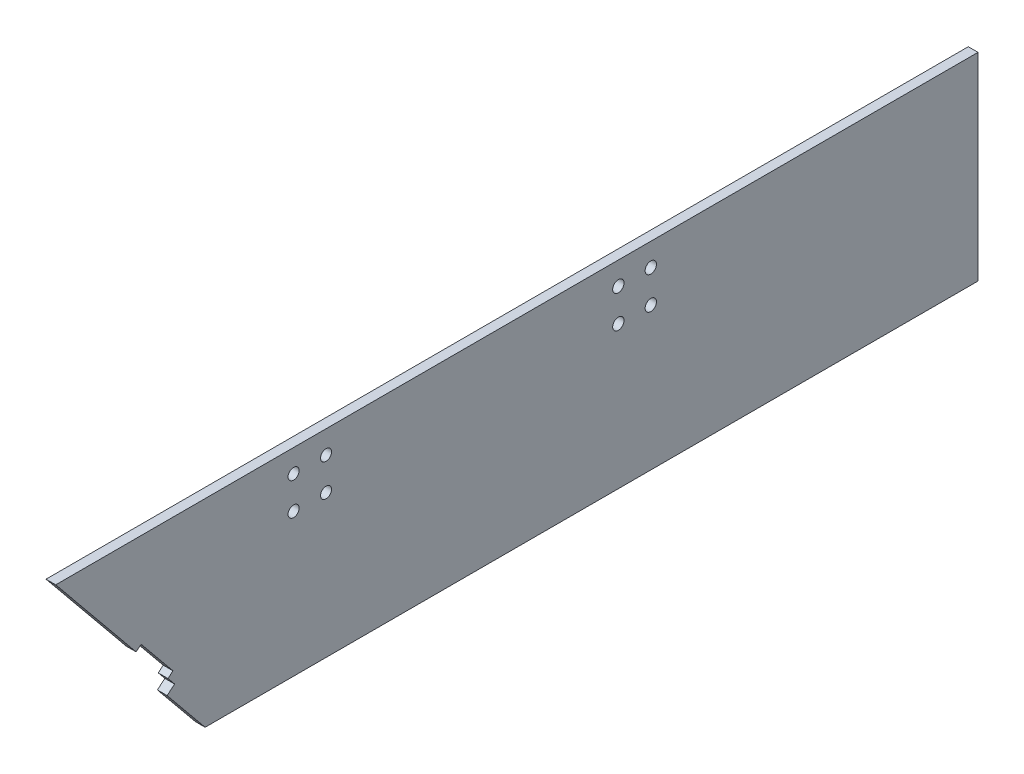
ISO-10303-21;
HEADER;
FILE_DESCRIPTION(('STEP AP214'),'2;1');
FILE_NAME('part.step','',(''),(''),'','','');
FILE_SCHEMA(('AUTOMOTIVE_DESIGN { 1 0 10303 214 1 1 1 1 }'));
ENDSEC;
DATA;
#1=APPLICATION_CONTEXT('core data for automotive mechanical design processes');
#2=APPLICATION_PROTOCOL_DEFINITION('international standard','automotive_design',2000,#1);
#3=PRODUCT_CONTEXT('',#1,'mechanical');
#4=PRODUCT('Part','Part','',(#3));
#5=PRODUCT_RELATED_PRODUCT_CATEGORY('part','',(#4));
#6=PRODUCT_DEFINITION_FORMATION('','',#4);
#7=PRODUCT_DEFINITION_CONTEXT('part definition',#1,'design');
#8=PRODUCT_DEFINITION('design','',#6,#7);
#9=PRODUCT_DEFINITION_SHAPE('','',#8);
#10=(LENGTH_UNIT() NAMED_UNIT(*) SI_UNIT(.MILLI.,.METRE.));
#11=(NAMED_UNIT(*) PLANE_ANGLE_UNIT() SI_UNIT($,.RADIAN.));
#12=(NAMED_UNIT(*) SI_UNIT($,.STERADIAN.) SOLID_ANGLE_UNIT());
#13=UNCERTAINTY_MEASURE_WITH_UNIT(LENGTH_MEASURE(1.E-05),#10,'distance_accuracy_value','');
#14=(GEOMETRIC_REPRESENTATION_CONTEXT(3) GLOBAL_UNCERTAINTY_ASSIGNED_CONTEXT((#13)) GLOBAL_UNIT_ASSIGNED_CONTEXT((#10,
#11,#12)) REPRESENTATION_CONTEXT('',''));
#15=CARTESIAN_POINT('',(0.,0.,0.));
#16=DIRECTION('',(0.,0.,1.));
#17=DIRECTION('',(1.,0.,0.));
#18=AXIS2_PLACEMENT_3D('',#15,#16,#17);
#19=CARTESIAN_POINT('',(3.,0.,220.));
#20=DIRECTION('',(1.,0.,0.));
#21=DIRECTION('',(0.,1.,0.));
#22=AXIS2_PLACEMENT_3D('',#19,#20,#21);
#23=PLANE('',#22);
#24=CARTESIAN_POINT('',(3.,58.999999999968,110.75468208532));
#25=DIRECTION('',(-1.,0.,0.));
#26=DIRECTION('',(0.,0.,1.));
#27=AXIS2_PLACEMENT_3D('',#24,#25,#26);
#28=CIRCLE('',#27,1.75);
#29=CARTESIAN_POINT('',(3.,58.999999999968,112.50468208532));
#30=VERTEX_POINT('',#29);
#31=EDGE_CURVE('E224',#30,#30,#28,.T.);
#32=ORIENTED_EDGE('',*,*,#31,.T.);
#33=EDGE_LOOP('',(#32));
#34=FACE_BOUND('',#33,.T.);
#35=CARTESIAN_POINT('',(3.,58.999999999968,100.75468208532));
#36=DIRECTION('',(-1.,0.,0.));
#37=DIRECTION('',(0.,0.,1.));
#38=AXIS2_PLACEMENT_3D('',#35,#36,#37);
#39=CIRCLE('',#38,1.75);
#40=CARTESIAN_POINT('',(3.,58.999999999968,102.50468208532));
#41=VERTEX_POINT('',#40);
#42=EDGE_CURVE('E238',#41,#41,#39,.T.);
#43=ORIENTED_EDGE('',*,*,#42,.T.);
#44=EDGE_LOOP('',(#43));
#45=FACE_BOUND('',#44,.T.);
#46=CARTESIAN_POINT('',(3.,68.999999999968,100.75468208532));
#47=DIRECTION('',(-1.,0.,0.));
#48=DIRECTION('',(0.,0.,1.));
#49=AXIS2_PLACEMENT_3D('',#46,#47,#48);
#50=CIRCLE('',#49,1.75);
#51=CARTESIAN_POINT('',(3.,68.999999999968,102.50468208532));
#52=VERTEX_POINT('',#51);
#53=EDGE_CURVE('E230',#52,#52,#50,.T.);
#54=ORIENTED_EDGE('',*,*,#53,.T.);
#55=EDGE_LOOP('',(#54));
#56=FACE_BOUND('',#55,.T.);
#57=CARTESIAN_POINT('',(3.,68.999999999968,110.75468208532));
#58=DIRECTION('',(-1.,0.,0.));
#59=DIRECTION('',(0.,0.,1.));
#60=AXIS2_PLACEMENT_3D('',#57,#58,#59);
#61=CIRCLE('',#60,1.75);
#62=CARTESIAN_POINT('',(3.,68.999999999968,112.50468208532));
#63=VERTEX_POINT('',#62);
#64=EDGE_CURVE('E249',#63,#63,#61,.T.);
#65=ORIENTED_EDGE('',*,*,#64,.T.);
#66=EDGE_LOOP('',(#65));
#67=FACE_BOUND('',#66,.T.);
#68=DIRECTION('',(0.,0.,-1.));
#69=VECTOR('',#68,1.);
#70=CARTESIAN_POINT('',(3.,15.,0.));
#71=LINE('',#70,#69);
#72=CARTESIAN_POINT('',(3.,15.,238.));
#73=VERTEX_POINT('',#72);
#74=CARTESIAN_POINT('',(3.,15.,0.));
#75=VERTEX_POINT('',#74);
#76=EDGE_CURVE('E122',#73,#75,#71,.T.);
#77=ORIENTED_EDGE('',*,*,#76,.T.);
#78=DIRECTION('',(0.,-1.,0.));
#79=VECTOR('',#78,1.);
#80=CARTESIAN_POINT('',(3.,0.,0.));
#81=LINE('',#80,#79);
#82=CARTESIAN_POINT('',(3.,76.,0.));
#83=VERTEX_POINT('',#82);
#84=EDGE_CURVE('E316',#83,#75,#81,.T.);
#85=ORIENTED_EDGE('',*,*,#84,.F.);
#86=DIRECTION('',(0.,0.,-1.));
#87=VECTOR('',#86,1.);
#88=CARTESIAN_POINT('',(3.,76.,220.));
#89=LINE('',#88,#87);
#90=CARTESIAN_POINT('',(3.,76.,284.));
#91=VERTEX_POINT('',#90);
#92=EDGE_CURVE('E11',#91,#83,#89,.T.);
#93=ORIENTED_EDGE('',*,*,#92,.F.);
#94=DIRECTION('',(0.,0.774168521996595,0.63297954117776));
#95=VECTOR('',#94,1.);
#96=CARTESIAN_POINT('',(3.,45.7367160679064,259.255982342882));
#97=LINE('',#96,#95);
#98=CARTESIAN_POINT('',(3.,45.7367160679064,259.255982342882));
#99=VERTEX_POINT('',#98);
#100=EDGE_CURVE('E142',#99,#91,#97,.T.);
#101=ORIENTED_EDGE('',*,*,#100,.F.);
#102=DIRECTION('',(0.,-0.632979541177748,0.774168521996605));
#103=VECTOR('',#102,1.);
#104=CARTESIAN_POINT('',(3.,47.0026751502619,257.707645298889));
#105=LINE('',#104,#103);
#106=CARTESIAN_POINT('',(3.,47.0026751502619,257.707645298889));
#107=VERTEX_POINT('',#106);
#108=EDGE_CURVE('E171',#107,#99,#105,.T.);
#109=ORIENTED_EDGE('',*,*,#108,.F.);
#110=DIRECTION('',(0.,0.774168521996594,0.632979541177761));
#111=VECTOR('',#110,1.);
#112=CARTESIAN_POINT('',(3.,35.0030630593147,247.896462410633));
#113=LINE('',#112,#111);
#114=CARTESIAN_POINT('',(3.,35.0030630593147,247.896462410633));
#115=VERTEX_POINT('',#114);
#116=EDGE_CURVE('E167',#115,#107,#113,.T.);
#117=ORIENTED_EDGE('',*,*,#116,.F.);
#118=DIRECTION('',(0.,0.632979541177761,-0.774168521996594));
#119=VECTOR('',#118,1.);
#120=CARTESIAN_POINT('',(3.,33.7371039769592,249.444799454626));
#121=LINE('',#120,#119);
#122=CARTESIAN_POINT('',(3.,33.7371039769592,249.444799454626));
#123=VERTEX_POINT('',#122);
#124=EDGE_CURVE('E163',#123,#115,#121,.T.);
#125=ORIENTED_EDGE('',*,*,#124,.F.);
#126=DIRECTION('',(0.,0.774168521996594,0.632979541177761));
#127=VECTOR('',#126,1.);
#128=CARTESIAN_POINT('',(3.,31.2210562804703,247.387615945799));
#129=LINE('',#128,#127);
#130=CARTESIAN_POINT('',(3.,31.2210562804703,247.387615945799));
#131=VERTEX_POINT('',#130);
#132=EDGE_CURVE('E154',#131,#123,#129,.T.);
#133=ORIENTED_EDGE('',*,*,#132,.F.);
#134=DIRECTION('',(0.,0.632979541177761,-0.774168521996594));
#135=VECTOR('',#134,1.);
#136=CARTESIAN_POINT('',(3.,29.322117656937,249.710121511789));
#137=LINE('',#136,#135);
#138=CARTESIAN_POINT('',(3.,29.322117656937,249.710121511789));
#139=VERTEX_POINT('',#138);
#140=EDGE_CURVE('E148',#139,#131,#137,.T.);
#141=ORIENTED_EDGE('',*,*,#140,.F.);
#142=DIRECTION('',(0.,0.774168521996594,0.632979541177761));
#143=VECTOR('',#142,1.);
#144=CARTESIAN_POINT('',(3.,29.322117656937,249.710121511789));
#145=LINE('',#144,#143);
#146=EDGE_CURVE('E137',#73,#139,#145,.T.);
#147=ORIENTED_EDGE('',*,*,#146,.F.);
#148=EDGE_LOOP('',(#77,#85,#93,#101,#109,#117,#125,#133,#141,#147));
#149=FACE_BOUND('',#148,.T.);
#150=CARTESIAN_POINT('',(3.,58.999999999968,200.75468208532));
#151=DIRECTION('',(-1.,0.,0.));
#152=DIRECTION('',(0.,0.,1.));
#153=AXIS2_PLACEMENT_3D('',#150,#151,#152);
#154=CIRCLE('',#153,1.69999999999999);
#155=CARTESIAN_POINT('',(3.,58.999999999968,202.45468208532));
#156=VERTEX_POINT('',#155);
#157=EDGE_CURVE('E276',#156,#156,#154,.T.);
#158=ORIENTED_EDGE('',*,*,#157,.T.);
#159=EDGE_LOOP('',(#158));
#160=FACE_BOUND('',#159,.T.);
#161=CARTESIAN_POINT('',(3.,68.999999999968,200.75468208532));
#162=DIRECTION('',(-1.,0.,0.));
#163=DIRECTION('',(0.,0.,1.));
#164=AXIS2_PLACEMENT_3D('',#161,#162,#163);
#165=CIRCLE('',#164,1.69999999999999);
#166=CARTESIAN_POINT('',(3.,68.999999999968,202.45468208532));
#167=VERTEX_POINT('',#166);
#168=EDGE_CURVE('E288',#167,#167,#165,.T.);
#169=ORIENTED_EDGE('',*,*,#168,.T.);
#170=EDGE_LOOP('',(#169));
#171=FACE_BOUND('',#170,.T.);
#172=CARTESIAN_POINT('',(3.,58.999999999968,210.75468208532));
#173=DIRECTION('',(-1.,0.,0.));
#174=DIRECTION('',(0.,0.,1.));
#175=AXIS2_PLACEMENT_3D('',#172,#173,#174);
#176=CIRCLE('',#175,1.69999999999999);
#177=CARTESIAN_POINT('',(3.,58.999999999968,212.45468208532));
#178=VERTEX_POINT('',#177);
#179=EDGE_CURVE('E300',#178,#178,#176,.T.);
#180=ORIENTED_EDGE('',*,*,#179,.T.);
#181=EDGE_LOOP('',(#180));
#182=FACE_BOUND('',#181,.T.);
#183=CARTESIAN_POINT('',(3.,68.999999999968,210.75468208532));
#184=DIRECTION('',(-1.,0.,0.));
#185=DIRECTION('',(0.,0.,1.));
#186=AXIS2_PLACEMENT_3D('',#183,#184,#185);
#187=CIRCLE('',#186,1.69999999999999);
#188=CARTESIAN_POINT('',(3.,68.999999999968,212.45468208532));
#189=VERTEX_POINT('',#188);
#190=EDGE_CURVE('E312',#189,#189,#187,.T.);
#191=ORIENTED_EDGE('',*,*,#190,.T.);
#192=EDGE_LOOP('',(#191));
#193=FACE_BOUND('',#192,.T.);
#194=ADVANCED_FACE('F47',(#34,#45,#56,#67,#149,#160,#171,#182,#193),#23,.T.);
#195=CARTESIAN_POINT('',(0.,76.,220.));
#196=DIRECTION('',(0.,-1.,0.));
#197=DIRECTION('',(0.,0.,-1.));
#198=AXIS2_PLACEMENT_3D('',#195,#196,#197);
#199=PLANE('',#198);
#200=DIRECTION('',(-1.,0.,0.));
#201=VECTOR('',#200,1.);
#202=CARTESIAN_POINT('',(0.,76.,0.));
#203=LINE('',#202,#201);
#204=CARTESIAN_POINT('',(0.,76.,0.));
#205=VERTEX_POINT('',#204);
#206=EDGE_CURVE('E319',#83,#205,#203,.T.);
#207=ORIENTED_EDGE('',*,*,#206,.T.);
#208=DIRECTION('',(0.,0.,-1.));
#209=VECTOR('',#208,1.);
#210=CARTESIAN_POINT('',(0.,76.,220.));
#211=LINE('',#210,#209);
#212=CARTESIAN_POINT('',(0.,76.,284.));
#213=VERTEX_POINT('',#212);
#214=EDGE_CURVE('E55',#213,#205,#211,.T.);
#215=ORIENTED_EDGE('',*,*,#214,.F.);
#216=DIRECTION('',(-1.,0.,0.));
#217=VECTOR('',#216,1.);
#218=CARTESIAN_POINT('',(3.,76.,284.));
#219=LINE('',#218,#217);
#220=EDGE_CURVE('E199',#91,#213,#219,.T.);
#221=ORIENTED_EDGE('',*,*,#220,.F.);
#222=ORIENTED_EDGE('',*,*,#92,.T.);
#223=EDGE_LOOP('',(#207,#215,#221,#222));
#224=FACE_BOUND('',#223,.T.);
#225=ADVANCED_FACE('F331',(#224),#199,.F.);
#226=CARTESIAN_POINT('',(0.,0.,220.));
#227=DIRECTION('',(-1.,0.,0.));
#228=DIRECTION('',(0.,0.,1.));
#229=AXIS2_PLACEMENT_3D('',#226,#227,#228);
#230=PLANE('',#229);
#231=CARTESIAN_POINT('',(0.,58.999999999968,110.75468208532));
#232=DIRECTION('',(-1.,0.,0.));
#233=DIRECTION('',(0.,0.,1.));
#234=AXIS2_PLACEMENT_3D('',#231,#232,#233);
#235=CIRCLE('',#234,1.75);
#236=CARTESIAN_POINT('',(0.,58.999999999968,112.50468208532));
#237=VERTEX_POINT('',#236);
#238=EDGE_CURVE('E242',#237,#237,#235,.T.);
#239=ORIENTED_EDGE('',*,*,#238,.F.);
#240=EDGE_LOOP('',(#239));
#241=FACE_BOUND('',#240,.T.);
#242=CARTESIAN_POINT('',(0.,58.999999999968,100.75468208532));
#243=DIRECTION('',(-1.,0.,0.));
#244=DIRECTION('',(0.,0.,1.));
#245=AXIS2_PLACEMENT_3D('',#242,#243,#244);
#246=CIRCLE('',#245,1.75);
#247=CARTESIAN_POINT('',(0.,58.999999999968,102.50468208532));
#248=VERTEX_POINT('',#247);
#249=EDGE_CURVE('E234',#248,#248,#246,.T.);
#250=ORIENTED_EDGE('',*,*,#249,.F.);
#251=EDGE_LOOP('',(#250));
#252=FACE_BOUND('',#251,.T.);
#253=CARTESIAN_POINT('',(0.,68.999999999968,100.75468208532));
#254=DIRECTION('',(-1.,0.,0.));
#255=DIRECTION('',(0.,0.,1.));
#256=AXIS2_PLACEMENT_3D('',#253,#254,#255);
#257=CIRCLE('',#256,1.75);
#258=CARTESIAN_POINT('',(0.,68.999999999968,102.50468208532));
#259=VERTEX_POINT('',#258);
#260=EDGE_CURVE('E225',#259,#259,#257,.T.);
#261=ORIENTED_EDGE('',*,*,#260,.F.);
#262=EDGE_LOOP('',(#261));
#263=FACE_BOUND('',#262,.T.);
#264=CARTESIAN_POINT('',(0.,68.999999999968,110.75468208532));
#265=DIRECTION('',(-1.,0.,0.));
#266=DIRECTION('',(0.,0.,1.));
#267=AXIS2_PLACEMENT_3D('',#264,#265,#266);
#268=CIRCLE('',#267,1.75);
#269=CARTESIAN_POINT('',(0.,68.999999999968,112.50468208532));
#270=VERTEX_POINT('',#269);
#271=EDGE_CURVE('E229',#270,#270,#268,.T.);
#272=ORIENTED_EDGE('',*,*,#271,.F.);
#273=EDGE_LOOP('',(#272));
#274=FACE_BOUND('',#273,.T.);
#275=DIRECTION('',(0.,0.,-1.));
#276=VECTOR('',#275,1.);
#277=CARTESIAN_POINT('',(0.,15.,0.));
#278=LINE('',#277,#276);
#279=CARTESIAN_POINT('',(0.,15.,238.));
#280=VERTEX_POINT('',#279);
#281=CARTESIAN_POINT('',(0.,15.,0.));
#282=VERTEX_POINT('',#281);
#283=EDGE_CURVE('E62',#280,#282,#278,.T.);
#284=ORIENTED_EDGE('',*,*,#283,.F.);
#285=DIRECTION('',(0.,0.774168521996594,0.632979541177761));
#286=VECTOR('',#285,1.);
#287=CARTESIAN_POINT('',(0.,29.322117656937,249.710121511789));
#288=LINE('',#287,#286);
#289=CARTESIAN_POINT('',(0.,29.322117656937,249.710121511789));
#290=VERTEX_POINT('',#289);
#291=EDGE_CURVE('E139',#280,#290,#288,.T.);
#292=ORIENTED_EDGE('',*,*,#291,.T.);
#293=DIRECTION('',(0.,0.632979541177761,-0.774168521996594));
#294=VECTOR('',#293,1.);
#295=CARTESIAN_POINT('',(0.,29.322117656937,249.710121511789));
#296=LINE('',#295,#294);
#297=CARTESIAN_POINT('',(0.,31.2210562804703,247.387615945799));
#298=VERTEX_POINT('',#297);
#299=EDGE_CURVE('E180',#290,#298,#296,.T.);
#300=ORIENTED_EDGE('',*,*,#299,.T.);
#301=DIRECTION('',(0.,0.774168521996594,0.632979541177761));
#302=VECTOR('',#301,1.);
#303=CARTESIAN_POINT('',(0.,31.2210562804703,247.387615945799));
#304=LINE('',#303,#302);
#305=CARTESIAN_POINT('',(0.,33.7371039769592,249.444799454626));
#306=VERTEX_POINT('',#305);
#307=EDGE_CURVE('E184',#298,#306,#304,.T.);
#308=ORIENTED_EDGE('',*,*,#307,.T.);
#309=DIRECTION('',(0.,0.632979541177761,-0.774168521996594));
#310=VECTOR('',#309,1.);
#311=CARTESIAN_POINT('',(0.,33.7371039769592,249.444799454626));
#312=LINE('',#311,#310);
#313=CARTESIAN_POINT('',(0.,35.0030630593147,247.896462410633));
#314=VERTEX_POINT('',#313);
#315=EDGE_CURVE('E188',#306,#314,#312,.T.);
#316=ORIENTED_EDGE('',*,*,#315,.T.);
#317=DIRECTION('',(0.,0.774168521996594,0.632979541177761));
#318=VECTOR('',#317,1.);
#319=CARTESIAN_POINT('',(0.,35.0030630593147,247.896462410633));
#320=LINE('',#319,#318);
#321=CARTESIAN_POINT('',(0.,47.0026751502619,257.707645298889));
#322=VERTEX_POINT('',#321);
#323=EDGE_CURVE('E192',#314,#322,#320,.T.);
#324=ORIENTED_EDGE('',*,*,#323,.T.);
#325=DIRECTION('',(0.,-0.632979541177748,0.774168521996605));
#326=VECTOR('',#325,1.);
#327=CARTESIAN_POINT('',(0.,47.0026751502619,257.707645298889));
#328=LINE('',#327,#326);
#329=CARTESIAN_POINT('',(0.,45.7367160679064,259.255982342882));
#330=VERTEX_POINT('',#329);
#331=EDGE_CURVE('E157',#322,#330,#328,.T.);
#332=ORIENTED_EDGE('',*,*,#331,.T.);
#333=DIRECTION('',(0.,0.774168521996595,0.63297954117776));
#334=VECTOR('',#333,1.);
#335=CARTESIAN_POINT('',(0.,45.7367160679064,259.255982342882));
#336=LINE('',#335,#334);
#337=EDGE_CURVE('E150',#330,#213,#336,.T.);
#338=ORIENTED_EDGE('',*,*,#337,.T.);
#339=ORIENTED_EDGE('',*,*,#214,.T.);
#340=DIRECTION('',(0.,1.,0.));
#341=VECTOR('',#340,1.);
#342=CARTESIAN_POINT('',(0.,0.,0.));
#343=LINE('',#342,#341);
#344=EDGE_CURVE('E69',#282,#205,#343,.T.);
#345=ORIENTED_EDGE('',*,*,#344,.F.);
#346=EDGE_LOOP('',(#284,#292,#300,#308,#316,#324,#332,#338,#339,#345));
#347=FACE_BOUND('',#346,.T.);
#348=CARTESIAN_POINT('',(0.,58.9999999999555,60.7546820853201));
#349=DIRECTION('',(-1.,0.,0.));
#350=DIRECTION('',(0.,0.,1.));
#351=AXIS2_PLACEMENT_3D('',#348,#349,#350);
#352=CIRCLE('',#351,1.725);
#353=CARTESIAN_POINT('',(0.,58.9999999999555,62.4796820853202));
#354=VERTEX_POINT('',#353);
#355=EDGE_CURVE('E260',#354,#354,#352,.T.);
#356=ORIENTED_EDGE('',*,*,#355,.F.);
#357=EDGE_LOOP('',(#356));
#358=FACE_BOUND('',#357,.T.);
#359=CARTESIAN_POINT('',(0.,58.999999999968,200.75468208532));
#360=DIRECTION('',(-1.,0.,0.));
#361=DIRECTION('',(0.,0.,1.));
#362=AXIS2_PLACEMENT_3D('',#359,#360,#361);
#363=CIRCLE('',#362,1.725);
#364=CARTESIAN_POINT('',(0.,58.999999999968,202.47968208532));
#365=VERTEX_POINT('',#364);
#366=EDGE_CURVE('E268',#365,#365,#363,.T.);
#367=ORIENTED_EDGE('',*,*,#366,.F.);
#368=EDGE_LOOP('',(#367));
#369=FACE_BOUND('',#368,.T.);
#370=CARTESIAN_POINT('',(0.,68.999999999968,200.75468208532));
#371=DIRECTION('',(-1.,0.,0.));
#372=DIRECTION('',(0.,0.,1.));
#373=AXIS2_PLACEMENT_3D('',#370,#371,#372);
#374=CIRCLE('',#373,1.725);
#375=CARTESIAN_POINT('',(0.,68.999999999968,202.47968208532));
#376=VERTEX_POINT('',#375);
#377=EDGE_CURVE('E280',#376,#376,#374,.T.);
#378=ORIENTED_EDGE('',*,*,#377,.F.);
#379=EDGE_LOOP('',(#378));
#380=FACE_BOUND('',#379,.T.);
#381=CARTESIAN_POINT('',(0.,58.999999999968,210.75468208532));
#382=DIRECTION('',(-1.,0.,0.));
#383=DIRECTION('',(0.,0.,1.));
#384=AXIS2_PLACEMENT_3D('',#381,#382,#383);
#385=CIRCLE('',#384,1.725);
#386=CARTESIAN_POINT('',(0.,58.999999999968,212.47968208532));
#387=VERTEX_POINT('',#386);
#388=EDGE_CURVE('E292',#387,#387,#385,.T.);
#389=ORIENTED_EDGE('',*,*,#388,.F.);
#390=EDGE_LOOP('',(#389));
#391=FACE_BOUND('',#390,.T.);
#392=CARTESIAN_POINT('',(0.,68.999999999968,210.75468208532));
#393=DIRECTION('',(-1.,0.,0.));
#394=DIRECTION('',(0.,0.,1.));
#395=AXIS2_PLACEMENT_3D('',#392,#393,#394);
#396=CIRCLE('',#395,1.725);
#397=CARTESIAN_POINT('',(0.,68.999999999968,212.47968208532));
#398=VERTEX_POINT('',#397);
#399=EDGE_CURVE('E304',#398,#398,#396,.T.);
#400=ORIENTED_EDGE('',*,*,#399,.F.);
#401=EDGE_LOOP('',(#400));
#402=FACE_BOUND('',#401,.T.);
#403=ADVANCED_FACE('F326',(#241,#252,#263,#274,#347,#358,#369,#380,#391,#402),#230,.T.);
#404=CARTESIAN_POINT('',(0.,0.,0.));
#405=DIRECTION('',(0.,0.,1.));
#406=DIRECTION('',(1.,0.,0.));
#407=AXIS2_PLACEMENT_3D('',#404,#405,#406);
#408=PLANE('',#407);
#409=ORIENTED_EDGE('',*,*,#84,.T.);
#410=DIRECTION('',(-1.,0.,0.));
#411=VECTOR('',#410,1.);
#412=CARTESIAN_POINT('',(3.,15.,0.));
#413=LINE('',#412,#411);
#414=EDGE_CURVE('E127',#75,#282,#413,.T.);
#415=ORIENTED_EDGE('',*,*,#414,.T.);
#416=ORIENTED_EDGE('',*,*,#344,.T.);
#417=ORIENTED_EDGE('',*,*,#206,.F.);
#418=EDGE_LOOP('',(#409,#415,#416,#417));
#419=FACE_BOUND('',#418,.T.);
#420=ADVANCED_FACE('F332',(#419),#408,.F.);
#421=CARTESIAN_POINT('',(0.,68.999999999968,210.75468208532));
#422=DIRECTION('',(-1.,0.,0.));
#423=DIRECTION('',(0.,0.,1.));
#424=AXIS2_PLACEMENT_3D('',#421,#422,#423);
#425=CYLINDRICAL_SURFACE('',#424,1.69999999999999);
#426=ORIENTED_EDGE('',*,*,#190,.F.);
#427=EDGE_LOOP('',(#426));
#428=FACE_BOUND('',#427,.T.);
#429=CARTESIAN_POINT('',(0.025000000000025,68.999999999968,210.75468208532));
#430=DIRECTION('',(-1.,0.,0.));
#431=DIRECTION('',(0.,0.,1.));
#432=AXIS2_PLACEMENT_3D('',#429,#430,#431);
#433=CIRCLE('',#432,1.69999999999999);
#434=CARTESIAN_POINT('',(0.025000000000025,68.999999999968,212.45468208532));
#435=VERTEX_POINT('',#434);
#436=EDGE_CURVE('E308',#435,#435,#433,.T.);
#437=ORIENTED_EDGE('',*,*,#436,.T.);
#438=EDGE_LOOP('',(#437));
#439=FACE_BOUND('',#438,.T.);
#440=ADVANCED_FACE('F390',(#428,#439),#425,.F.);
#441=CARTESIAN_POINT('',(0.,68.999999999968,210.75468208532));
#442=DIRECTION('',(-1.,0.,0.));
#443=DIRECTION('',(0.,0.,1.));
#444=AXIS2_PLACEMENT_3D('',#441,#442,#443);
#445=CONICAL_SURFACE('',#444,1.725,0.785398163397136);
#446=ORIENTED_EDGE('',*,*,#436,.F.);
#447=EDGE_LOOP('',(#446));
#448=FACE_BOUND('',#447,.T.);
#449=ORIENTED_EDGE('',*,*,#399,.T.);
#450=EDGE_LOOP('',(#449));
#451=FACE_BOUND('',#450,.T.);
#452=ADVANCED_FACE('F397',(#448,#451),#445,.F.);
#453=CARTESIAN_POINT('',(0.,58.999999999968,210.75468208532));
#454=DIRECTION('',(-1.,0.,0.));
#455=DIRECTION('',(0.,0.,1.));
#456=AXIS2_PLACEMENT_3D('',#453,#454,#455);
#457=CYLINDRICAL_SURFACE('',#456,1.69999999999999);
#458=ORIENTED_EDGE('',*,*,#179,.F.);
#459=EDGE_LOOP('',(#458));
#460=FACE_BOUND('',#459,.T.);
#461=CARTESIAN_POINT('',(0.025000000000025,58.999999999968,210.75468208532));
#462=DIRECTION('',(-1.,0.,0.));
#463=DIRECTION('',(0.,0.,1.));
#464=AXIS2_PLACEMENT_3D('',#461,#462,#463);
#465=CIRCLE('',#464,1.69999999999999);
#466=CARTESIAN_POINT('',(0.025000000000025,58.999999999968,212.45468208532));
#467=VERTEX_POINT('',#466);
#468=EDGE_CURVE('E296',#467,#467,#465,.T.);
#469=ORIENTED_EDGE('',*,*,#468,.T.);
#470=EDGE_LOOP('',(#469));
#471=FACE_BOUND('',#470,.T.);
#472=ADVANCED_FACE('F401',(#460,#471),#457,.F.);
#473=CARTESIAN_POINT('',(0.,58.999999999968,210.75468208532));
#474=DIRECTION('',(-1.,0.,0.));
#475=DIRECTION('',(0.,0.,1.));
#476=AXIS2_PLACEMENT_3D('',#473,#474,#475);
#477=CONICAL_SURFACE('',#476,1.725,0.785398163397275);
#478=ORIENTED_EDGE('',*,*,#468,.F.);
#479=EDGE_LOOP('',(#478));
#480=FACE_BOUND('',#479,.T.);
#481=ORIENTED_EDGE('',*,*,#388,.T.);
#482=EDGE_LOOP('',(#481));
#483=FACE_BOUND('',#482,.T.);
#484=ADVANCED_FACE('F405',(#480,#483),#477,.F.);
#485=CARTESIAN_POINT('',(0.,68.999999999968,200.75468208532));
#486=DIRECTION('',(-1.,0.,0.));
#487=DIRECTION('',(0.,0.,1.));
#488=AXIS2_PLACEMENT_3D('',#485,#486,#487);
#489=CYLINDRICAL_SURFACE('',#488,1.69999999999999);
#490=ORIENTED_EDGE('',*,*,#168,.F.);
#491=EDGE_LOOP('',(#490));
#492=FACE_BOUND('',#491,.T.);
#493=CARTESIAN_POINT('',(0.025000000000025,68.999999999968,200.75468208532));
#494=DIRECTION('',(-1.,0.,0.));
#495=DIRECTION('',(0.,0.,1.));
#496=AXIS2_PLACEMENT_3D('',#493,#494,#495);
#497=CIRCLE('',#496,1.69999999999999);
#498=CARTESIAN_POINT('',(0.025000000000025,68.999999999968,202.45468208532));
#499=VERTEX_POINT('',#498);
#500=EDGE_CURVE('E284',#499,#499,#497,.T.);
#501=ORIENTED_EDGE('',*,*,#500,.T.);
#502=EDGE_LOOP('',(#501));
#503=FACE_BOUND('',#502,.T.);
#504=ADVANCED_FACE('F409',(#492,#503),#489,.F.);
#505=CARTESIAN_POINT('',(0.,68.999999999968,200.75468208532));
#506=DIRECTION('',(-1.,0.,0.));
#507=DIRECTION('',(0.,0.,1.));
#508=AXIS2_PLACEMENT_3D('',#505,#506,#507);
#509=CONICAL_SURFACE('',#508,1.725,0.785398163397136);
#510=ORIENTED_EDGE('',*,*,#500,.F.);
#511=EDGE_LOOP('',(#510));
#512=FACE_BOUND('',#511,.T.);
#513=ORIENTED_EDGE('',*,*,#377,.T.);
#514=EDGE_LOOP('',(#513));
#515=FACE_BOUND('',#514,.T.);
#516=ADVANCED_FACE('F413',(#512,#515),#509,.F.);
#517=CARTESIAN_POINT('',(0.,58.999999999968,200.75468208532));
#518=DIRECTION('',(-1.,0.,0.));
#519=DIRECTION('',(0.,0.,1.));
#520=AXIS2_PLACEMENT_3D('',#517,#518,#519);
#521=CYLINDRICAL_SURFACE('',#520,1.69999999999999);
#522=ORIENTED_EDGE('',*,*,#157,.F.);
#523=EDGE_LOOP('',(#522));
#524=FACE_BOUND('',#523,.T.);
#525=CARTESIAN_POINT('',(0.025000000000025,58.999999999968,200.75468208532));
#526=DIRECTION('',(-1.,0.,0.));
#527=DIRECTION('',(0.,0.,1.));
#528=AXIS2_PLACEMENT_3D('',#525,#526,#527);
#529=CIRCLE('',#528,1.69999999999999);
#530=CARTESIAN_POINT('',(0.025000000000025,58.999999999968,202.45468208532));
#531=VERTEX_POINT('',#530);
#532=EDGE_CURVE('E272',#531,#531,#529,.T.);
#533=ORIENTED_EDGE('',*,*,#532,.T.);
#534=EDGE_LOOP('',(#533));
#535=FACE_BOUND('',#534,.T.);
#536=ADVANCED_FACE('F417',(#524,#535),#521,.F.);
#537=CARTESIAN_POINT('',(0.,58.999999999968,200.75468208532));
#538=DIRECTION('',(-1.,0.,0.));
#539=DIRECTION('',(0.,0.,1.));
#540=AXIS2_PLACEMENT_3D('',#537,#538,#539);
#541=CONICAL_SURFACE('',#540,1.725,0.785398163397275);
#542=ORIENTED_EDGE('',*,*,#532,.F.);
#543=EDGE_LOOP('',(#542));
#544=FACE_BOUND('',#543,.T.);
#545=ORIENTED_EDGE('',*,*,#366,.T.);
#546=EDGE_LOOP('',(#545));
#547=FACE_BOUND('',#546,.T.);
#548=ADVANCED_FACE('F421',(#544,#547),#541,.F.);
#549=CARTESIAN_POINT('',(0.,58.9999999999555,60.7546820853201));
#550=DIRECTION('',(-1.,0.,0.));
#551=DIRECTION('',(0.,0.,1.));
#552=AXIS2_PLACEMENT_3D('',#549,#550,#551);
#553=CONICAL_SURFACE('',#552,1.725,0.785398163397275);
#554=CARTESIAN_POINT('',(0.025000000000025,58.9999999999555,60.7546820853201));
#555=DIRECTION('',(-1.,0.,0.));
#556=DIRECTION('',(0.,0.,1.));
#557=AXIS2_PLACEMENT_3D('',#554,#555,#556);
#558=CIRCLE('',#557,1.69999999999999);
#559=CARTESIAN_POINT('',(0.025000000000025,58.9999999999555,62.4546820853201));
#560=VERTEX_POINT('',#559);
#561=EDGE_CURVE('E264',#560,#560,#558,.T.);
#562=ORIENTED_EDGE('',*,*,#561,.F.);
#563=EDGE_LOOP('',(#562));
#564=FACE_BOUND('',#563,.T.);
#565=ORIENTED_EDGE('',*,*,#355,.T.);
#566=EDGE_LOOP('',(#565));
#567=FACE_BOUND('',#566,.T.);
#568=ADVANCED_FACE('F425',(#564,#567),#553,.F.);
#569=CARTESIAN_POINT('',(3.,15.,0.));
#570=DIRECTION('',(0.,1.,0.));
#571=DIRECTION('',(0.,0.,1.));
#572=AXIS2_PLACEMENT_3D('',#569,#570,#571);
#573=PLANE('',#572);
#574=ORIENTED_EDGE('',*,*,#283,.T.);
#575=ORIENTED_EDGE('',*,*,#414,.F.);
#576=ORIENTED_EDGE('',*,*,#76,.F.);
#577=DIRECTION('',(-1.,0.,0.));
#578=VECTOR('',#577,1.);
#579=CARTESIAN_POINT('',(3.,15.,238.));
#580=LINE('',#579,#578);
#581=EDGE_CURVE('E125',#73,#280,#580,.T.);
#582=ORIENTED_EDGE('',*,*,#581,.T.);
#583=EDGE_LOOP('',(#574,#575,#576,#582));
#584=FACE_BOUND('',#583,.T.);
#585=ADVANCED_FACE('F124',(#584),#573,.F.);
#586=CARTESIAN_POINT('',(3.,68.999999999968,110.75468208532));
#587=DIRECTION('',(-1.,0.,0.));
#588=DIRECTION('',(0.,0.,1.));
#589=AXIS2_PLACEMENT_3D('',#586,#587,#588);
#590=CYLINDRICAL_SURFACE('',#589,1.75);
#591=ORIENTED_EDGE('',*,*,#64,.F.);
#592=EDGE_LOOP('',(#591));
#593=FACE_BOUND('',#592,.T.);
#594=ORIENTED_EDGE('',*,*,#271,.T.);
#595=EDGE_LOOP('',(#594));
#596=FACE_BOUND('',#595,.T.);
#597=ADVANCED_FACE('F376',(#593,#596),#590,.F.);
#598=CARTESIAN_POINT('',(3.,68.999999999968,100.75468208532));
#599=DIRECTION('',(-1.,0.,0.));
#600=DIRECTION('',(0.,0.,1.));
#601=AXIS2_PLACEMENT_3D('',#598,#599,#600);
#602=CYLINDRICAL_SURFACE('',#601,1.75);
#603=ORIENTED_EDGE('',*,*,#53,.F.);
#604=EDGE_LOOP('',(#603));
#605=FACE_BOUND('',#604,.T.);
#606=ORIENTED_EDGE('',*,*,#260,.T.);
#607=EDGE_LOOP('',(#606));
#608=FACE_BOUND('',#607,.T.);
#609=ADVANCED_FACE('F379',(#605,#608),#602,.F.);
#610=CARTESIAN_POINT('',(3.,58.999999999968,100.75468208532));
#611=DIRECTION('',(-1.,0.,0.));
#612=DIRECTION('',(0.,0.,1.));
#613=AXIS2_PLACEMENT_3D('',#610,#611,#612);
#614=CYLINDRICAL_SURFACE('',#613,1.75);
#615=ORIENTED_EDGE('',*,*,#42,.F.);
#616=EDGE_LOOP('',(#615));
#617=FACE_BOUND('',#616,.T.);
#618=ORIENTED_EDGE('',*,*,#249,.T.);
#619=EDGE_LOOP('',(#618));
#620=FACE_BOUND('',#619,.T.);
#621=ADVANCED_FACE('F435',(#617,#620),#614,.F.);
#622=CARTESIAN_POINT('',(3.,58.999999999968,110.75468208532));
#623=DIRECTION('',(-1.,0.,0.));
#624=DIRECTION('',(0.,0.,1.));
#625=AXIS2_PLACEMENT_3D('',#622,#623,#624);
#626=CYLINDRICAL_SURFACE('',#625,1.75);
#627=ORIENTED_EDGE('',*,*,#31,.F.);
#628=EDGE_LOOP('',(#627));
#629=FACE_BOUND('',#628,.T.);
#630=ORIENTED_EDGE('',*,*,#238,.T.);
#631=EDGE_LOOP('',(#630));
#632=FACE_BOUND('',#631,.T.);
#633=ADVANCED_FACE('F431',(#629,#632),#626,.F.);
#634=CARTESIAN_POINT('',(0.,58.9999999999555,60.7546820853201));
#635=DIRECTION('',(-1.,0.,0.));
#636=DIRECTION('',(0.,0.,1.));
#637=AXIS2_PLACEMENT_3D('',#634,#635,#636);
#638=PLANE('',#637);
#639=CARTESIAN_POINT('',(0.,58.9999999999555,60.7546820853201));
#640=DIRECTION('',(-1.,0.,0.));
#641=DIRECTION('',(0.,0.,1.));
#642=AXIS2_PLACEMENT_3D('',#639,#640,#641);
#643=CIRCLE('',#642,1.69999999999998);
#644=CARTESIAN_POINT('',(0.,58.9999999999555,62.4546820853201));
#645=VERTEX_POINT('',#644);
#646=EDGE_CURVE('E203',#645,#645,#643,.T.);
#647=ORIENTED_EDGE('',*,*,#646,.T.);
#648=EDGE_LOOP('',(#647));
#649=FACE_BOUND('',#648,.T.);
#650=ADVANCED_FACE('F434',(#649),#638,.T.);
#651=CARTESIAN_POINT('',(3.,58.9999999999555,60.7546820853201));
#652=DIRECTION('',(-1.,0.,0.));
#653=DIRECTION('',(0.,0.,1.));
#654=AXIS2_PLACEMENT_3D('',#651,#652,#653);
#655=CYLINDRICAL_SURFACE('',#654,1.69999999999998);
#656=ORIENTED_EDGE('',*,*,#646,.F.);
#657=EDGE_LOOP('',(#656));
#658=FACE_BOUND('',#657,.T.);
#659=ORIENTED_EDGE('',*,*,#561,.T.);
#660=EDGE_LOOP('',(#659));
#661=FACE_BOUND('',#660,.T.);
#662=ADVANCED_FACE('F445',(#658,#661),#655,.T.);
#663=CARTESIAN_POINT('',(3.,45.7367160679064,259.255982342882));
#664=DIRECTION('',(0.,-0.63297954117776,0.774168521996595));
#665=DIRECTION('',(0.,-0.774168521996595,-0.63297954117776));
#666=AXIS2_PLACEMENT_3D('',#663,#664,#665);
#667=PLANE('',#666);
#668=ORIENTED_EDGE('',*,*,#337,.F.);
#669=DIRECTION('',(-1.,0.,0.));
#670=VECTOR('',#669,1.);
#671=CARTESIAN_POINT('',(3.,45.7367160679064,259.255982342882));
#672=LINE('',#671,#670);
#673=EDGE_CURVE('E204',#99,#330,#672,.T.);
#674=ORIENTED_EDGE('',*,*,#673,.F.);
#675=ORIENTED_EDGE('',*,*,#100,.T.);
#676=ORIENTED_EDGE('',*,*,#220,.T.);
#677=EDGE_LOOP('',(#668,#674,#675,#676));
#678=FACE_BOUND('',#677,.T.);
#679=ADVANCED_FACE('F336',(#678),#667,.T.);
#680=CARTESIAN_POINT('',(3.,47.0026751502619,257.707645298889));
#681=DIRECTION('',(0.,-0.774168521996605,-0.632979541177748));
#682=DIRECTION('',(0.,0.632979541177748,-0.774168521996605));
#683=AXIS2_PLACEMENT_3D('',#680,#681,#682);
#684=PLANE('',#683);
#685=ORIENTED_EDGE('',*,*,#331,.F.);
#686=DIRECTION('',(-1.,0.,0.));
#687=VECTOR('',#686,1.);
#688=CARTESIAN_POINT('',(3.,47.0026751502619,257.707645298889));
#689=LINE('',#688,#687);
#690=EDGE_CURVE('E207',#107,#322,#689,.T.);
#691=ORIENTED_EDGE('',*,*,#690,.F.);
#692=ORIENTED_EDGE('',*,*,#108,.T.);
#693=ORIENTED_EDGE('',*,*,#673,.T.);
#694=EDGE_LOOP('',(#685,#691,#692,#693));
#695=FACE_BOUND('',#694,.T.);
#696=ADVANCED_FACE('F339',(#695),#684,.T.);
#697=CARTESIAN_POINT('',(3.,35.0030630593147,247.896462410633));
#698=DIRECTION('',(0.,-0.632979541177761,0.774168521996594));
#699=DIRECTION('',(0.,-0.774168521996594,-0.632979541177761));
#700=AXIS2_PLACEMENT_3D('',#697,#698,#699);
#701=PLANE('',#700);
#702=ORIENTED_EDGE('',*,*,#323,.F.);
#703=DIRECTION('',(-1.,0.,0.));
#704=VECTOR('',#703,1.);
#705=CARTESIAN_POINT('',(3.,35.0030630593147,247.896462410633));
#706=LINE('',#705,#704);
#707=EDGE_CURVE('E210',#115,#314,#706,.T.);
#708=ORIENTED_EDGE('',*,*,#707,.F.);
#709=ORIENTED_EDGE('',*,*,#116,.T.);
#710=ORIENTED_EDGE('',*,*,#690,.T.);
#711=EDGE_LOOP('',(#702,#708,#709,#710));
#712=FACE_BOUND('',#711,.T.);
#713=ADVANCED_FACE('F344',(#712),#701,.T.);
#714=CARTESIAN_POINT('',(3.,33.7371039769592,249.444799454626));
#715=DIRECTION('',(0.,0.774168521996594,0.632979541177761));
#716=DIRECTION('',(0.,-0.632979541177761,0.774168521996594));
#717=AXIS2_PLACEMENT_3D('',#714,#715,#716);
#718=PLANE('',#717);
#719=ORIENTED_EDGE('',*,*,#315,.F.);
#720=DIRECTION('',(-1.,0.,0.));
#721=VECTOR('',#720,1.);
#722=CARTESIAN_POINT('',(3.,33.7371039769592,249.444799454626));
#723=LINE('',#722,#721);
#724=EDGE_CURVE('E213',#123,#306,#723,.T.);
#725=ORIENTED_EDGE('',*,*,#724,.F.);
#726=ORIENTED_EDGE('',*,*,#124,.T.);
#727=ORIENTED_EDGE('',*,*,#707,.T.);
#728=EDGE_LOOP('',(#719,#725,#726,#727));
#729=FACE_BOUND('',#728,.T.);
#730=ADVANCED_FACE('F347',(#729),#718,.T.);
#731=CARTESIAN_POINT('',(3.,31.2210562804703,247.387615945799));
#732=DIRECTION('',(0.,-0.632979541177761,0.774168521996594));
#733=DIRECTION('',(0.,-0.774168521996594,-0.632979541177761));
#734=AXIS2_PLACEMENT_3D('',#731,#732,#733);
#735=PLANE('',#734);
#736=ORIENTED_EDGE('',*,*,#307,.F.);
#737=DIRECTION('',(-1.,0.,0.));
#738=VECTOR('',#737,1.);
#739=CARTESIAN_POINT('',(3.,31.2210562804703,247.387615945799));
#740=LINE('',#739,#738);
#741=EDGE_CURVE('E216',#131,#298,#740,.T.);
#742=ORIENTED_EDGE('',*,*,#741,.F.);
#743=ORIENTED_EDGE('',*,*,#132,.T.);
#744=ORIENTED_EDGE('',*,*,#724,.T.);
#745=EDGE_LOOP('',(#736,#742,#743,#744));
#746=FACE_BOUND('',#745,.T.);
#747=ADVANCED_FACE('F350',(#746),#735,.T.);
#748=CARTESIAN_POINT('',(3.,29.322117656937,249.710121511789));
#749=DIRECTION('',(0.,0.774168521996594,0.632979541177761));
#750=DIRECTION('',(0.,-0.632979541177761,0.774168521996594));
#751=AXIS2_PLACEMENT_3D('',#748,#749,#750);
#752=PLANE('',#751);
#753=ORIENTED_EDGE('',*,*,#299,.F.);
#754=DIRECTION('',(-1.,0.,0.));
#755=VECTOR('',#754,1.);
#756=CARTESIAN_POINT('',(3.,29.322117656937,249.710121511789));
#757=LINE('',#756,#755);
#758=EDGE_CURVE('E141',#139,#290,#757,.T.);
#759=ORIENTED_EDGE('',*,*,#758,.F.);
#760=ORIENTED_EDGE('',*,*,#140,.T.);
#761=ORIENTED_EDGE('',*,*,#741,.T.);
#762=EDGE_LOOP('',(#753,#759,#760,#761));
#763=FACE_BOUND('',#762,.T.);
#764=ADVANCED_FACE('F353',(#763),#752,.T.);
#765=CARTESIAN_POINT('',(3.,29.322117656937,249.710121511789));
#766=DIRECTION('',(0.,-0.632979541177761,0.774168521996594));
#767=DIRECTION('',(0.,-0.774168521996594,-0.632979541177761));
#768=AXIS2_PLACEMENT_3D('',#765,#766,#767);
#769=PLANE('',#768);
#770=ORIENTED_EDGE('',*,*,#291,.F.);
#771=ORIENTED_EDGE('',*,*,#581,.F.);
#772=ORIENTED_EDGE('',*,*,#146,.T.);
#773=ORIENTED_EDGE('',*,*,#758,.T.);
#774=EDGE_LOOP('',(#770,#771,#772,#773));
#775=FACE_BOUND('',#774,.T.);
#776=ADVANCED_FACE('F136',(#775),#769,.T.);
#777=CLOSED_SHELL('',(#194,#225,#403,#420,#440,#452,#472,#484,#504,#516,#536,#548,#568,#585,
#597,#609,#621,#633,#650,#662,#679,#696,#713,#730,#747,#764,#776));
#778=MANIFOLD_SOLID_BREP('B2',#777);
#779=ADVANCED_BREP_SHAPE_REPRESENTATION('',(#18,#778),#14);
#780=SHAPE_DEFINITION_REPRESENTATION(#9,#779);
ENDSEC;
END-ISO-10303-21;
